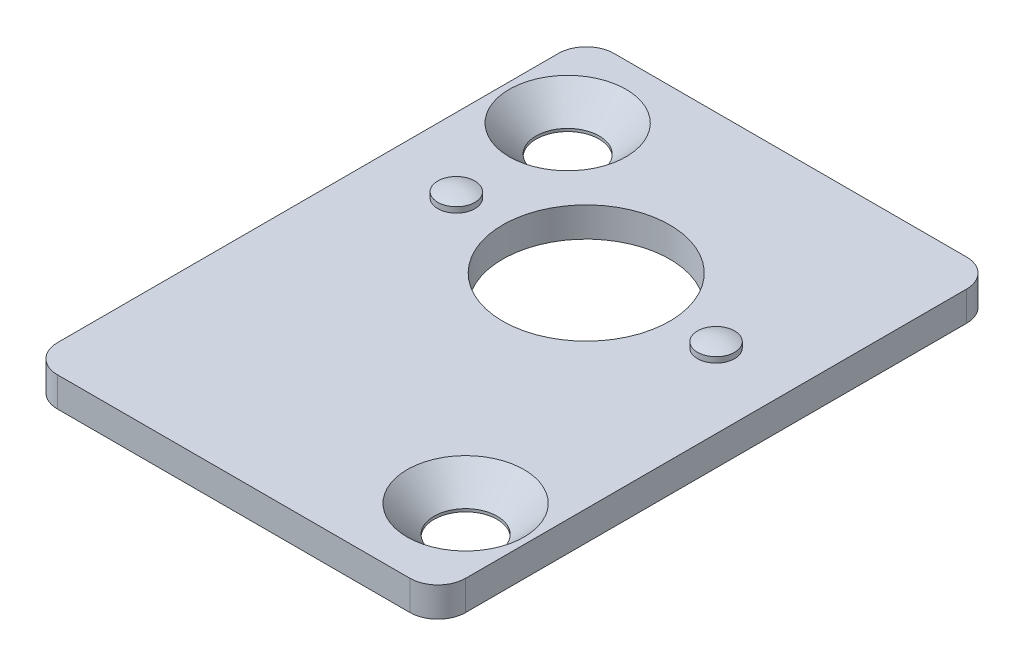
ISO-10303-21;
HEADER;
FILE_DESCRIPTION(('STEP AP214'),'2;1');
FILE_NAME('part.step','',(''),(''),'','','');
FILE_SCHEMA(('AUTOMOTIVE_DESIGN { 1 0 10303 214 1 1 1 1 }'));
ENDSEC;
DATA;
#1=APPLICATION_CONTEXT('core data for automotive mechanical design processes');
#2=APPLICATION_PROTOCOL_DEFINITION('international standard','automotive_design',2000,#1);
#3=PRODUCT_CONTEXT('',#1,'mechanical');
#4=PRODUCT('Part','Part','',(#3));
#5=PRODUCT_RELATED_PRODUCT_CATEGORY('part','',(#4));
#6=PRODUCT_DEFINITION_FORMATION('','',#4);
#7=PRODUCT_DEFINITION_CONTEXT('part definition',#1,'design');
#8=PRODUCT_DEFINITION('design','',#6,#7);
#9=PRODUCT_DEFINITION_SHAPE('','',#8);
#10=(LENGTH_UNIT() NAMED_UNIT(*) SI_UNIT(.MILLI.,.METRE.));
#11=(NAMED_UNIT(*) PLANE_ANGLE_UNIT() SI_UNIT($,.RADIAN.));
#12=(NAMED_UNIT(*) SI_UNIT($,.STERADIAN.) SOLID_ANGLE_UNIT());
#13=UNCERTAINTY_MEASURE_WITH_UNIT(LENGTH_MEASURE(1.E-05),#10,'distance_accuracy_value','');
#14=(GEOMETRIC_REPRESENTATION_CONTEXT(3) GLOBAL_UNCERTAINTY_ASSIGNED_CONTEXT((#13)) GLOBAL_UNIT_ASSIGNED_CONTEXT((#10,
#11,#12)) REPRESENTATION_CONTEXT('',''));
#15=CARTESIAN_POINT('',(0.,0.,0.));
#16=DIRECTION('',(0.,0.,1.));
#17=DIRECTION('',(1.,0.,0.));
#18=AXIS2_PLACEMENT_3D('',#15,#16,#17);
#19=CARTESIAN_POINT('',(11.,-1.6,-15.));
#20=DIRECTION('',(1.,0.,0.));
#21=DIRECTION('',(0.,0.,-1.));
#22=AXIS2_PLACEMENT_3D('',#19,#20,#21);
#23=PLANE('',#22);
#24=DIRECTION('',(0.,0.,-1.));
#25=VECTOR('',#24,1.);
#26=CARTESIAN_POINT('',(11.,-1.6,-15.));
#27=LINE('',#26,#25);
#28=CARTESIAN_POINT('',(11.,-1.6,13.5));
#29=VERTEX_POINT('',#28);
#30=CARTESIAN_POINT('',(11.,-1.6,-13.5));
#31=VERTEX_POINT('',#30);
#32=EDGE_CURVE('E154',#29,#31,#27,.T.);
#33=ORIENTED_EDGE('',*,*,#32,.T.);
#34=DIRECTION('',(0.,1.,0.));
#35=VECTOR('',#34,1.);
#36=CARTESIAN_POINT('',(11.,-1.6,-13.5));
#37=LINE('',#36,#35);
#38=CARTESIAN_POINT('',(11.,0.,-13.5));
#39=VERTEX_POINT('',#38);
#40=EDGE_CURVE('E150',#31,#39,#37,.T.);
#41=ORIENTED_EDGE('',*,*,#40,.T.);
#42=DIRECTION('',(0.,0.,-1.));
#43=VECTOR('',#42,1.);
#44=CARTESIAN_POINT('',(11.,0.,-15.));
#45=LINE('',#44,#43);
#46=CARTESIAN_POINT('',(11.,0.,13.5));
#47=VERTEX_POINT('',#46);
#48=EDGE_CURVE('E103',#47,#39,#45,.T.);
#49=ORIENTED_EDGE('',*,*,#48,.F.);
#50=DIRECTION('',(0.,1.,0.));
#51=VECTOR('',#50,1.);
#52=CARTESIAN_POINT('',(11.,-1.6,13.5));
#53=LINE('',#52,#51);
#54=EDGE_CURVE('E148',#47,#29,#53,.F.);
#55=ORIENTED_EDGE('',*,*,#54,.T.);
#56=EDGE_LOOP('',(#33,#41,#49,#55));
#57=FACE_BOUND('',#56,.T.);
#58=ADVANCED_FACE('F32',(#57),#23,.T.);
#59=CARTESIAN_POINT('',(-11.,-1.6,15.));
#60=DIRECTION('',(0.,0.,1.));
#61=DIRECTION('',(1.,0.,0.));
#62=AXIS2_PLACEMENT_3D('',#59,#60,#61);
#63=PLANE('',#62);
#64=DIRECTION('',(1.,0.,0.));
#65=VECTOR('',#64,1.);
#66=CARTESIAN_POINT('',(-11.,-1.6,15.));
#67=LINE('',#66,#65);
#68=CARTESIAN_POINT('',(-9.5,-1.6,15.));
#69=VERTEX_POINT('',#68);
#70=CARTESIAN_POINT('',(9.5,-1.6,15.));
#71=VERTEX_POINT('',#70);
#72=EDGE_CURVE('E129',#69,#71,#67,.T.);
#73=ORIENTED_EDGE('',*,*,#72,.T.);
#74=DIRECTION('',(0.,1.,0.));
#75=VECTOR('',#74,1.);
#76=CARTESIAN_POINT('',(9.5,-1.6,15.));
#77=LINE('',#76,#75);
#78=CARTESIAN_POINT('',(9.5,0.,15.));
#79=VERTEX_POINT('',#78);
#80=EDGE_CURVE('E11',#71,#79,#77,.T.);
#81=ORIENTED_EDGE('',*,*,#80,.T.);
#82=DIRECTION('',(1.,0.,0.));
#83=VECTOR('',#82,1.);
#84=CARTESIAN_POINT('',(-11.,0.,15.));
#85=LINE('',#84,#83);
#86=CARTESIAN_POINT('',(-9.5,0.,15.));
#87=VERTEX_POINT('',#86);
#88=EDGE_CURVE('E156',#87,#79,#85,.T.);
#89=ORIENTED_EDGE('',*,*,#88,.F.);
#90=DIRECTION('',(0.,1.,0.));
#91=VECTOR('',#90,1.);
#92=CARTESIAN_POINT('',(-9.5,-1.6,15.));
#93=LINE('',#92,#91);
#94=EDGE_CURVE('E40',#87,#69,#93,.F.);
#95=ORIENTED_EDGE('',*,*,#94,.T.);
#96=EDGE_LOOP('',(#73,#81,#89,#95));
#97=FACE_BOUND('',#96,.T.);
#98=ADVANCED_FACE('F227',(#97),#63,.T.);
#99=CARTESIAN_POINT('',(-11.,-1.6,-15.));
#100=DIRECTION('',(-1.,0.,0.));
#101=DIRECTION('',(0.,0.,1.));
#102=AXIS2_PLACEMENT_3D('',#99,#100,#101);
#103=PLANE('',#102);
#104=DIRECTION('',(0.,0.,1.));
#105=VECTOR('',#104,1.);
#106=CARTESIAN_POINT('',(-11.,0.,-15.));
#107=LINE('',#106,#105);
#108=CARTESIAN_POINT('',(-11.,0.,-13.5));
#109=VERTEX_POINT('',#108);
#110=CARTESIAN_POINT('',(-11.,0.,13.5));
#111=VERTEX_POINT('',#110);
#112=EDGE_CURVE('E119',#109,#111,#107,.T.);
#113=ORIENTED_EDGE('',*,*,#112,.F.);
#114=DIRECTION('',(0.,1.,0.));
#115=VECTOR('',#114,1.);
#116=CARTESIAN_POINT('',(-11.,-1.6,-13.5));
#117=LINE('',#116,#115);
#118=CARTESIAN_POINT('',(-11.,-1.6,-13.5));
#119=VERTEX_POINT('',#118);
#120=EDGE_CURVE('E140',#109,#119,#117,.F.);
#121=ORIENTED_EDGE('',*,*,#120,.T.);
#122=DIRECTION('',(0.,0.,1.));
#123=VECTOR('',#122,1.);
#124=CARTESIAN_POINT('',(-11.,-1.6,-15.));
#125=LINE('',#124,#123);
#126=CARTESIAN_POINT('',(-11.,-1.6,13.5));
#127=VERTEX_POINT('',#126);
#128=EDGE_CURVE('E158',#119,#127,#125,.T.);
#129=ORIENTED_EDGE('',*,*,#128,.T.);
#130=DIRECTION('',(0.,1.,0.));
#131=VECTOR('',#130,1.);
#132=CARTESIAN_POINT('',(-11.,-1.6,13.5));
#133=LINE('',#132,#131);
#134=EDGE_CURVE('E137',#127,#111,#133,.T.);
#135=ORIENTED_EDGE('',*,*,#134,.T.);
#136=EDGE_LOOP('',(#113,#121,#129,#135));
#137=FACE_BOUND('',#136,.T.);
#138=ADVANCED_FACE('F232',(#137),#103,.T.);
#139=CARTESIAN_POINT('',(-11.,-1.6,-15.));
#140=DIRECTION('',(0.,0.,-1.));
#141=DIRECTION('',(-1.,0.,0.));
#142=AXIS2_PLACEMENT_3D('',#139,#140,#141);
#143=PLANE('',#142);
#144=DIRECTION('',(-1.,0.,0.));
#145=VECTOR('',#144,1.);
#146=CARTESIAN_POINT('',(-11.,-1.6,-15.));
#147=LINE('',#146,#145);
#148=CARTESIAN_POINT('',(9.49999999999999,-1.6,-15.));
#149=VERTEX_POINT('',#148);
#150=CARTESIAN_POINT('',(-9.5,-1.6,-15.));
#151=VERTEX_POINT('',#150);
#152=EDGE_CURVE('E155',#149,#151,#147,.T.);
#153=ORIENTED_EDGE('',*,*,#152,.T.);
#154=DIRECTION('',(0.,1.,0.));
#155=VECTOR('',#154,1.);
#156=CARTESIAN_POINT('',(-9.5,-1.6,-15.));
#157=LINE('',#156,#155);
#158=CARTESIAN_POINT('',(-9.5,0.,-15.));
#159=VERTEX_POINT('',#158);
#160=EDGE_CURVE('E118',#151,#159,#157,.T.);
#161=ORIENTED_EDGE('',*,*,#160,.T.);
#162=DIRECTION('',(-1.,0.,0.));
#163=VECTOR('',#162,1.);
#164=CARTESIAN_POINT('',(-11.,0.,-15.));
#165=LINE('',#164,#163);
#166=CARTESIAN_POINT('',(9.49999999999999,0.,-15.));
#167=VERTEX_POINT('',#166);
#168=EDGE_CURVE('E101',#167,#159,#165,.T.);
#169=ORIENTED_EDGE('',*,*,#168,.F.);
#170=DIRECTION('',(0.,1.,0.));
#171=VECTOR('',#170,1.);
#172=CARTESIAN_POINT('',(9.49999999999999,-1.6,-15.));
#173=LINE('',#172,#171);
#174=EDGE_CURVE('E115',#167,#149,#173,.F.);
#175=ORIENTED_EDGE('',*,*,#174,.T.);
#176=EDGE_LOOP('',(#153,#161,#169,#175));
#177=FACE_BOUND('',#176,.T.);
#178=ADVANCED_FACE('F114',(#177),#143,.T.);
#179=CARTESIAN_POINT('',(0.,-1.6,0.));
#180=DIRECTION('',(0.,1.,0.));
#181=DIRECTION('',(0.,0.,1.));
#182=AXIS2_PLACEMENT_3D('',#179,#180,#181);
#183=PLANE('',#182);
#184=CARTESIAN_POINT('',(-7.,-1.6,-4.00000000000001));
#185=DIRECTION('',(0.,-1.,0.));
#186=DIRECTION('',(0.,0.,-1.));
#187=AXIS2_PLACEMENT_3D('',#184,#185,#186);
#188=CIRCLE('',#187,1.);
#189=CARTESIAN_POINT('',(-7.,-1.6,-5.00000000000001));
#190=VERTEX_POINT('',#189);
#191=EDGE_CURVE('E453',#190,#190,#188,.T.);
#192=ORIENTED_EDGE('',*,*,#191,.F.);
#193=EDGE_LOOP('',(#192));
#194=FACE_BOUND('',#193,.T.);
#195=CARTESIAN_POINT('',(7.,-1.6,-4.00000000000001));
#196=DIRECTION('',(0.,-1.,0.));
#197=DIRECTION('',(0.,0.,-1.));
#198=AXIS2_PLACEMENT_3D('',#195,#196,#197);
#199=CIRCLE('',#198,1.);
#200=CARTESIAN_POINT('',(7.,-1.6,-5.00000000000001));
#201=VERTEX_POINT('',#200);
#202=EDGE_CURVE('E197',#201,#201,#199,.T.);
#203=ORIENTED_EDGE('',*,*,#202,.F.);
#204=EDGE_LOOP('',(#203));
#205=FACE_BOUND('',#204,.T.);
#206=CARTESIAN_POINT('',(0.,-1.6,-4.00000000000001));
#207=DIRECTION('',(0.,1.,0.));
#208=DIRECTION('',(0.,0.,1.));
#209=AXIS2_PLACEMENT_3D('',#206,#207,#208);
#210=CIRCLE('',#209,4.5);
#211=CARTESIAN_POINT('',(0.,-1.6,0.499999999999991));
#212=VERTEX_POINT('',#211);
#213=EDGE_CURVE('E187',#212,#212,#210,.T.);
#214=ORIENTED_EDGE('',*,*,#213,.T.);
#215=EDGE_LOOP('',(#214));
#216=FACE_BOUND('',#215,.T.);
#217=CARTESIAN_POINT('',(-7.5,-1.6,-10.5));
#218=DIRECTION('',(0.,1.,0.));
#219=DIRECTION('',(0.,0.,1.));
#220=AXIS2_PLACEMENT_3D('',#217,#218,#219);
#221=CIRCLE('',#220,1.7);
#222=CARTESIAN_POINT('',(-7.5,-1.6,-8.80000000000001));
#223=VERTEX_POINT('',#222);
#224=EDGE_CURVE('E175',#223,#223,#221,.T.);
#225=ORIENTED_EDGE('',*,*,#224,.T.);
#226=EDGE_LOOP('',(#225));
#227=FACE_BOUND('',#226,.T.);
#228=CARTESIAN_POINT('',(7.5,-1.6,9.99999999999999));
#229=DIRECTION('',(0.,1.,0.));
#230=DIRECTION('',(0.,0.,1.));
#231=AXIS2_PLACEMENT_3D('',#228,#229,#230);
#232=CIRCLE('',#231,1.7);
#233=CARTESIAN_POINT('',(7.5,-1.6,11.7));
#234=VERTEX_POINT('',#233);
#235=EDGE_CURVE('E169',#234,#234,#232,.T.);
#236=ORIENTED_EDGE('',*,*,#235,.T.);
#237=EDGE_LOOP('',(#236));
#238=FACE_BOUND('',#237,.T.);
#239=ORIENTED_EDGE('',*,*,#128,.F.);
#240=CARTESIAN_POINT('',(-9.5,-1.6,-13.5));
#241=DIRECTION('',(0.,1.,0.));
#242=DIRECTION('',(0.,0.,1.));
#243=AXIS2_PLACEMENT_3D('',#240,#241,#242);
#244=CIRCLE('',#243,1.5);
#245=EDGE_CURVE('E146',#119,#151,#244,.F.);
#246=ORIENTED_EDGE('',*,*,#245,.T.);
#247=ORIENTED_EDGE('',*,*,#152,.F.);
#248=CARTESIAN_POINT('',(9.5,-1.6,-13.5));
#249=DIRECTION('',(0.,1.,0.));
#250=DIRECTION('',(0.,0.,1.));
#251=AXIS2_PLACEMENT_3D('',#248,#249,#250);
#252=CIRCLE('',#251,1.5);
#253=EDGE_CURVE('E123',#149,#31,#252,.F.);
#254=ORIENTED_EDGE('',*,*,#253,.T.);
#255=ORIENTED_EDGE('',*,*,#32,.F.);
#256=CARTESIAN_POINT('',(9.5,-1.6,13.5));
#257=DIRECTION('',(0.,1.,0.));
#258=DIRECTION('',(0.,0.,1.));
#259=AXIS2_PLACEMENT_3D('',#256,#257,#258);
#260=CIRCLE('',#259,1.5);
#261=EDGE_CURVE('E47',#29,#71,#260,.F.);
#262=ORIENTED_EDGE('',*,*,#261,.T.);
#263=ORIENTED_EDGE('',*,*,#72,.F.);
#264=CARTESIAN_POINT('',(-9.5,-1.6,13.5));
#265=DIRECTION('',(0.,1.,0.));
#266=DIRECTION('',(0.,0.,1.));
#267=AXIS2_PLACEMENT_3D('',#264,#265,#266);
#268=CIRCLE('',#267,1.5);
#269=EDGE_CURVE('E142',#69,#127,#268,.F.);
#270=ORIENTED_EDGE('',*,*,#269,.T.);
#271=EDGE_LOOP('',(#239,#246,#247,#254,#255,#262,#263,#270));
#272=FACE_BOUND('',#271,.T.);
#273=ADVANCED_FACE('F268',(#194,#205,#216,#227,#238,#272),#183,.F.);
#274=CARTESIAN_POINT('',(0.,0.,0.));
#275=DIRECTION('',(0.,1.,0.));
#276=DIRECTION('',(0.,0.,1.));
#277=AXIS2_PLACEMENT_3D('',#274,#275,#276);
#278=PLANE('',#277);
#279=CARTESIAN_POINT('',(7.,0.,-4.00000000000001));
#280=DIRECTION('',(0.,1.,0.));
#281=DIRECTION('',(0.,0.,1.));
#282=AXIS2_PLACEMENT_3D('',#279,#280,#281);
#283=CIRCLE('',#282,1.);
#284=CARTESIAN_POINT('',(7.,0.,-3.00000000000001));
#285=VERTEX_POINT('',#284);
#286=EDGE_CURVE('E124',#285,#285,#283,.T.);
#287=ORIENTED_EDGE('',*,*,#286,.F.);
#288=EDGE_LOOP('',(#287));
#289=FACE_BOUND('',#288,.T.);
#290=CARTESIAN_POINT('',(-7.,0.,-4.00000000000001));
#291=DIRECTION('',(0.,1.,0.));
#292=DIRECTION('',(0.,0.,1.));
#293=AXIS2_PLACEMENT_3D('',#290,#291,#292);
#294=CIRCLE('',#293,1.);
#295=CARTESIAN_POINT('',(-7.,0.,-3.00000000000001));
#296=VERTEX_POINT('',#295);
#297=EDGE_CURVE('E183',#296,#296,#294,.T.);
#298=ORIENTED_EDGE('',*,*,#297,.F.);
#299=EDGE_LOOP('',(#298));
#300=FACE_BOUND('',#299,.T.);
#301=CARTESIAN_POINT('',(0.,0.,-4.00000000000001));
#302=DIRECTION('',(0.,1.,0.));
#303=DIRECTION('',(0.,0.,1.));
#304=AXIS2_PLACEMENT_3D('',#301,#302,#303);
#305=CIRCLE('',#304,4.5);
#306=CARTESIAN_POINT('',(0.,0.,0.499999999999991));
#307=VERTEX_POINT('',#306);
#308=EDGE_CURVE('E182',#307,#307,#305,.T.);
#309=ORIENTED_EDGE('',*,*,#308,.F.);
#310=EDGE_LOOP('',(#309));
#311=FACE_BOUND('',#310,.T.);
#312=CARTESIAN_POINT('',(-7.5,0.,-10.5));
#313=DIRECTION('',(0.,1.,0.));
#314=DIRECTION('',(0.,0.,1.));
#315=AXIS2_PLACEMENT_3D('',#312,#313,#314);
#316=CIRCLE('',#315,3.15);
#317=CARTESIAN_POINT('',(-7.5,0.,-7.35000000000001));
#318=VERTEX_POINT('',#317);
#319=EDGE_CURVE('E200',#318,#318,#316,.T.);
#320=ORIENTED_EDGE('',*,*,#319,.F.);
#321=EDGE_LOOP('',(#320));
#322=FACE_BOUND('',#321,.T.);
#323=CARTESIAN_POINT('',(7.5,0.,9.99999999999999));
#324=DIRECTION('',(0.,1.,0.));
#325=DIRECTION('',(0.,0.,1.));
#326=AXIS2_PLACEMENT_3D('',#323,#324,#325);
#327=CIRCLE('',#326,3.15);
#328=CARTESIAN_POINT('',(7.5,0.,13.15));
#329=VERTEX_POINT('',#328);
#330=EDGE_CURVE('E178',#329,#329,#327,.T.);
#331=ORIENTED_EDGE('',*,*,#330,.F.);
#332=EDGE_LOOP('',(#331));
#333=FACE_BOUND('',#332,.T.);
#334=ORIENTED_EDGE('',*,*,#168,.T.);
#335=CARTESIAN_POINT('',(-9.5,0.,-13.5));
#336=DIRECTION('',(0.,1.,0.));
#337=DIRECTION('',(0.,0.,1.));
#338=AXIS2_PLACEMENT_3D('',#335,#336,#337);
#339=CIRCLE('',#338,1.5);
#340=EDGE_CURVE('E108',#159,#109,#339,.T.);
#341=ORIENTED_EDGE('',*,*,#340,.T.);
#342=ORIENTED_EDGE('',*,*,#112,.T.);
#343=CARTESIAN_POINT('',(-9.5,0.,13.5));
#344=DIRECTION('',(0.,1.,0.));
#345=DIRECTION('',(0.,0.,1.));
#346=AXIS2_PLACEMENT_3D('',#343,#344,#345);
#347=CIRCLE('',#346,1.5);
#348=EDGE_CURVE('E126',#111,#87,#347,.T.);
#349=ORIENTED_EDGE('',*,*,#348,.T.);
#350=ORIENTED_EDGE('',*,*,#88,.T.);
#351=CARTESIAN_POINT('',(9.5,0.,13.5));
#352=DIRECTION('',(0.,1.,0.));
#353=DIRECTION('',(0.,0.,1.));
#354=AXIS2_PLACEMENT_3D('',#351,#352,#353);
#355=CIRCLE('',#354,1.5);
#356=EDGE_CURVE('E109',#79,#47,#355,.T.);
#357=ORIENTED_EDGE('',*,*,#356,.T.);
#358=ORIENTED_EDGE('',*,*,#48,.T.);
#359=CARTESIAN_POINT('',(9.5,0.,-13.5));
#360=DIRECTION('',(0.,1.,0.));
#361=DIRECTION('',(0.,0.,1.));
#362=AXIS2_PLACEMENT_3D('',#359,#360,#361);
#363=CIRCLE('',#362,1.5);
#364=EDGE_CURVE('E98',#39,#167,#363,.T.);
#365=ORIENTED_EDGE('',*,*,#364,.T.);
#366=EDGE_LOOP('',(#334,#341,#342,#349,#350,#357,#358,#365));
#367=FACE_BOUND('',#366,.T.);
#368=ADVANCED_FACE('F100',(#289,#300,#311,#322,#333,#367),#278,.T.);
#369=CARTESIAN_POINT('',(7.5,0.,9.99999999999999));
#370=DIRECTION('',(0.,1.,0.));
#371=DIRECTION('',(0.,0.,1.));
#372=AXIS2_PLACEMENT_3D('',#369,#370,#371);
#373=CYLINDRICAL_SURFACE('',#372,1.7);
#374=CARTESIAN_POINT('',(7.5,-1.45,9.99999999999999));
#375=DIRECTION('',(0.,1.,0.));
#376=DIRECTION('',(0.,0.,1.));
#377=AXIS2_PLACEMENT_3D('',#374,#375,#376);
#378=CIRCLE('',#377,1.7);
#379=CARTESIAN_POINT('',(7.5,-1.45,11.7));
#380=VERTEX_POINT('',#379);
#381=EDGE_CURVE('E163',#380,#380,#378,.T.);
#382=ORIENTED_EDGE('',*,*,#381,.T.);
#383=EDGE_LOOP('',(#382));
#384=FACE_BOUND('',#383,.T.);
#385=ORIENTED_EDGE('',*,*,#235,.F.);
#386=EDGE_LOOP('',(#385));
#387=FACE_BOUND('',#386,.T.);
#388=ADVANCED_FACE('F211',(#384,#387),#373,.F.);
#389=CARTESIAN_POINT('',(7.5,0.,9.99999999999999));
#390=DIRECTION('',(0.,1.,0.));
#391=DIRECTION('',(0.,0.,1.));
#392=AXIS2_PLACEMENT_3D('',#389,#390,#391);
#393=CONICAL_SURFACE('',#392,3.15,0.785398163397448);
#394=ORIENTED_EDGE('',*,*,#381,.F.);
#395=EDGE_LOOP('',(#394));
#396=FACE_BOUND('',#395,.T.);
#397=ORIENTED_EDGE('',*,*,#330,.T.);
#398=EDGE_LOOP('',(#397));
#399=FACE_BOUND('',#398,.T.);
#400=ADVANCED_FACE('F214',(#396,#399),#393,.F.);
#401=CARTESIAN_POINT('',(-7.5,0.,-10.5));
#402=DIRECTION('',(0.,1.,0.));
#403=DIRECTION('',(0.,0.,1.));
#404=AXIS2_PLACEMENT_3D('',#401,#402,#403);
#405=CYLINDRICAL_SURFACE('',#404,1.7);
#406=CARTESIAN_POINT('',(-7.5,-1.45,-10.5));
#407=DIRECTION('',(0.,1.,0.));
#408=DIRECTION('',(0.,0.,1.));
#409=AXIS2_PLACEMENT_3D('',#406,#407,#408);
#410=CIRCLE('',#409,1.7);
#411=CARTESIAN_POINT('',(-7.5,-1.45,-8.80000000000001));
#412=VERTEX_POINT('',#411);
#413=EDGE_CURVE('E179',#412,#412,#410,.T.);
#414=ORIENTED_EDGE('',*,*,#413,.T.);
#415=EDGE_LOOP('',(#414));
#416=FACE_BOUND('',#415,.T.);
#417=ORIENTED_EDGE('',*,*,#224,.F.);
#418=EDGE_LOOP('',(#417));
#419=FACE_BOUND('',#418,.T.);
#420=ADVANCED_FACE('F216',(#416,#419),#405,.F.);
#421=CARTESIAN_POINT('',(-7.5,0.,-10.5));
#422=DIRECTION('',(0.,1.,0.));
#423=DIRECTION('',(0.,0.,1.));
#424=AXIS2_PLACEMENT_3D('',#421,#422,#423);
#425=CONICAL_SURFACE('',#424,3.15,0.785398163397448);
#426=ORIENTED_EDGE('',*,*,#413,.F.);
#427=EDGE_LOOP('',(#426));
#428=FACE_BOUND('',#427,.T.);
#429=ORIENTED_EDGE('',*,*,#319,.T.);
#430=EDGE_LOOP('',(#429));
#431=FACE_BOUND('',#430,.T.);
#432=ADVANCED_FACE('F222',(#428,#431),#425,.F.);
#433=CARTESIAN_POINT('',(0.,-1.6,-4.00000000000001));
#434=DIRECTION('',(0.,1.,0.));
#435=DIRECTION('',(0.,0.,1.));
#436=AXIS2_PLACEMENT_3D('',#433,#434,#435);
#437=CYLINDRICAL_SURFACE('',#436,4.5);
#438=ORIENTED_EDGE('',*,*,#213,.F.);
#439=EDGE_LOOP('',(#438));
#440=FACE_BOUND('',#439,.T.);
#441=ORIENTED_EDGE('',*,*,#308,.T.);
#442=EDGE_LOOP('',(#441));
#443=FACE_BOUND('',#442,.T.);
#444=ADVANCED_FACE('F375',(#440,#443),#437,.F.);
#445=CARTESIAN_POINT('',(-7.,0.3,-4.00000000000001));
#446=DIRECTION('',(0.,-1.,0.));
#447=DIRECTION('',(0.,0.,-1.));
#448=AXIS2_PLACEMENT_3D('',#445,#446,#447);
#449=CYLINDRICAL_SURFACE('',#448,1.);
#450=CARTESIAN_POINT('',(-7.,0.3,-4.00000000000001));
#451=DIRECTION('',(0.,1.,0.));
#452=DIRECTION('',(0.,0.,1.));
#453=AXIS2_PLACEMENT_3D('',#450,#451,#452);
#454=CIRCLE('',#453,1.);
#455=CARTESIAN_POINT('',(-7.,0.3,-3.00000000000001));
#456=VERTEX_POINT('',#455);
#457=EDGE_CURVE('E180',#456,#456,#454,.T.);
#458=ORIENTED_EDGE('',*,*,#457,.F.);
#459=EDGE_LOOP('',(#458));
#460=FACE_BOUND('',#459,.T.);
#461=ORIENTED_EDGE('',*,*,#297,.T.);
#462=EDGE_LOOP('',(#461));
#463=FACE_BOUND('',#462,.T.);
#464=ADVANCED_FACE('F241',(#460,#463),#449,.T.);
#465=CARTESIAN_POINT('',(-7.,-2.1,-4.00000000000001));
#466=DIRECTION('',(0.,0.,1.));
#467=DIRECTION('',(1.,0.,0.));
#468=AXIS2_PLACEMENT_3D('',#465,#466,#467);
#469=SPHERICAL_SURFACE('',#468,2.6);
#470=CARTESIAN_POINT('',(-7.,-2.1,-4.00000000000001));
#471=DIRECTION('',(0.,1.,0.));
#472=DIRECTION('',(0.,0.,1.));
#473=AXIS2_PLACEMENT_3D('',#470,#471,#472);
#474=SPHERICAL_SURFACE('',#473,2.6);
#475=ORIENTED_EDGE('',*,*,#457,.T.);
#476=EDGE_LOOP('',(#475));
#477=FACE_BOUND('',#476,.T.);
#478=ADVANCED_FACE('F237',(#477),#474,.T.);
#479=CARTESIAN_POINT('',(7.,0.3,-4.00000000000001));
#480=DIRECTION('',(0.,-1.,0.));
#481=DIRECTION('',(0.,0.,-1.));
#482=AXIS2_PLACEMENT_3D('',#479,#480,#481);
#483=CYLINDRICAL_SURFACE('',#482,1.);
#484=CARTESIAN_POINT('',(7.,0.3,-4.00000000000001));
#485=DIRECTION('',(0.,-1.,0.));
#486=DIRECTION('',(0.,0.,1.));
#487=AXIS2_PLACEMENT_3D('',#484,#485,#486);
#488=CIRCLE('',#487,1.);
#489=CARTESIAN_POINT('',(7.,0.3,-3.00000000000001));
#490=VERTEX_POINT('',#489);
#491=EDGE_CURVE('E132',#490,#490,#488,.T.);
#492=ORIENTED_EDGE('',*,*,#491,.T.);
#493=EDGE_LOOP('',(#492));
#494=FACE_BOUND('',#493,.T.);
#495=ORIENTED_EDGE('',*,*,#286,.T.);
#496=EDGE_LOOP('',(#495));
#497=FACE_BOUND('',#496,.T.);
#498=ADVANCED_FACE('F240',(#494,#497),#483,.T.);
#499=CARTESIAN_POINT('',(7.,-2.1,-4.00000000000001));
#500=DIRECTION('',(0.,0.,1.));
#501=DIRECTION('',(1.,0.,0.));
#502=AXIS2_PLACEMENT_3D('',#499,#500,#501);
#503=SPHERICAL_SURFACE('',#502,2.6);
#504=CARTESIAN_POINT('',(7.,-2.1,-4.00000000000001));
#505=DIRECTION('',(0.,-1.,0.));
#506=DIRECTION('',(0.,0.,1.));
#507=AXIS2_PLACEMENT_3D('',#504,#505,#506);
#508=SPHERICAL_SURFACE('',#507,2.6);
#509=ORIENTED_EDGE('',*,*,#491,.F.);
#510=EDGE_LOOP('',(#509));
#511=FACE_BOUND('',#510,.T.);
#512=ADVANCED_FACE('F242',(#511),#508,.T.);
#513=CARTESIAN_POINT('',(7.,-1.3,-4.00000000000001));
#514=DIRECTION('',(0.,-1.,0.));
#515=DIRECTION('',(0.,0.,-1.));
#516=AXIS2_PLACEMENT_3D('',#513,#514,#515);
#517=CYLINDRICAL_SURFACE('',#516,1.);
#518=CARTESIAN_POINT('',(7.,-1.3,-4.00000000000001));
#519=DIRECTION('',(0.,-1.,0.));
#520=DIRECTION('',(0.,0.,-1.));
#521=AXIS2_PLACEMENT_3D('',#518,#519,#520);
#522=CIRCLE('',#521,1.);
#523=CARTESIAN_POINT('',(7.,-1.3,-5.00000000000001));
#524=VERTEX_POINT('',#523);
#525=EDGE_CURVE('E450',#524,#524,#522,.T.);
#526=ORIENTED_EDGE('',*,*,#525,.F.);
#527=EDGE_LOOP('',(#526));
#528=FACE_BOUND('',#527,.T.);
#529=ORIENTED_EDGE('',*,*,#202,.T.);
#530=EDGE_LOOP('',(#529));
#531=FACE_BOUND('',#530,.T.);
#532=ADVANCED_FACE('F245',(#528,#531),#517,.F.);
#533=CARTESIAN_POINT('',(7.,-1.3,-4.00000000000001));
#534=DIRECTION('',(0.,-1.,0.));
#535=DIRECTION('',(0.,0.,-1.));
#536=AXIS2_PLACEMENT_3D('',#533,#534,#535);
#537=PLANE('',#536);
#538=ORIENTED_EDGE('',*,*,#525,.T.);
#539=EDGE_LOOP('',(#538));
#540=FACE_BOUND('',#539,.T.);
#541=ADVANCED_FACE('F338',(#540),#537,.T.);
#542=CARTESIAN_POINT('',(-7.,-1.3,-4.00000000000001));
#543=DIRECTION('',(0.,-1.,0.));
#544=DIRECTION('',(0.,0.,-1.));
#545=AXIS2_PLACEMENT_3D('',#542,#543,#544);
#546=CYLINDRICAL_SURFACE('',#545,1.);
#547=CARTESIAN_POINT('',(-7.,-1.3,-4.00000000000001));
#548=DIRECTION('',(0.,-1.,0.));
#549=DIRECTION('',(0.,0.,-1.));
#550=AXIS2_PLACEMENT_3D('',#547,#548,#549);
#551=CIRCLE('',#550,1.);
#552=CARTESIAN_POINT('',(-7.,-1.3,-5.00000000000001));
#553=VERTEX_POINT('',#552);
#554=EDGE_CURVE('E194',#553,#553,#551,.T.);
#555=ORIENTED_EDGE('',*,*,#554,.F.);
#556=EDGE_LOOP('',(#555));
#557=FACE_BOUND('',#556,.T.);
#558=ORIENTED_EDGE('',*,*,#191,.T.);
#559=EDGE_LOOP('',(#558));
#560=FACE_BOUND('',#559,.T.);
#561=ADVANCED_FACE('F331',(#557,#560),#546,.F.);
#562=CARTESIAN_POINT('',(-7.,-1.3,-4.00000000000001));
#563=DIRECTION('',(0.,-1.,0.));
#564=DIRECTION('',(0.,0.,-1.));
#565=AXIS2_PLACEMENT_3D('',#562,#563,#564);
#566=PLANE('',#565);
#567=ORIENTED_EDGE('',*,*,#554,.T.);
#568=EDGE_LOOP('',(#567));
#569=FACE_BOUND('',#568,.T.);
#570=ADVANCED_FACE('F250',(#569),#566,.T.);
#571=CARTESIAN_POINT('',(-9.5,-1.6,-13.5));
#572=DIRECTION('',(0.,1.,0.));
#573=DIRECTION('',(0.,0.,1.));
#574=AXIS2_PLACEMENT_3D('',#571,#572,#573);
#575=CYLINDRICAL_SURFACE('',#574,1.5);
#576=ORIENTED_EDGE('',*,*,#245,.F.);
#577=ORIENTED_EDGE('',*,*,#120,.F.);
#578=ORIENTED_EDGE('',*,*,#340,.F.);
#579=ORIENTED_EDGE('',*,*,#160,.F.);
#580=EDGE_LOOP('',(#576,#577,#578,#579));
#581=FACE_BOUND('',#580,.T.);
#582=ADVANCED_FACE('F247',(#581),#575,.T.);
#583=CARTESIAN_POINT('',(9.5,-1.6,-13.5));
#584=DIRECTION('',(0.,1.,0.));
#585=DIRECTION('',(0.,0.,1.));
#586=AXIS2_PLACEMENT_3D('',#583,#584,#585);
#587=CYLINDRICAL_SURFACE('',#586,1.5);
#588=ORIENTED_EDGE('',*,*,#253,.F.);
#589=ORIENTED_EDGE('',*,*,#174,.F.);
#590=ORIENTED_EDGE('',*,*,#364,.F.);
#591=ORIENTED_EDGE('',*,*,#40,.F.);
#592=EDGE_LOOP('',(#588,#589,#590,#591));
#593=FACE_BOUND('',#592,.T.);
#594=ADVANCED_FACE('F122',(#593),#587,.T.);
#595=CARTESIAN_POINT('',(9.5,-1.6,13.5));
#596=DIRECTION('',(0.,1.,0.));
#597=DIRECTION('',(0.,0.,1.));
#598=AXIS2_PLACEMENT_3D('',#595,#596,#597);
#599=CYLINDRICAL_SURFACE('',#598,1.5);
#600=ORIENTED_EDGE('',*,*,#261,.F.);
#601=ORIENTED_EDGE('',*,*,#54,.F.);
#602=ORIENTED_EDGE('',*,*,#356,.F.);
#603=ORIENTED_EDGE('',*,*,#80,.F.);
#604=EDGE_LOOP('',(#600,#601,#602,#603));
#605=FACE_BOUND('',#604,.T.);
#606=ADVANCED_FACE('F253',(#605),#599,.T.);
#607=CARTESIAN_POINT('',(-9.5,-1.6,13.5));
#608=DIRECTION('',(0.,1.,0.));
#609=DIRECTION('',(0.,0.,1.));
#610=AXIS2_PLACEMENT_3D('',#607,#608,#609);
#611=CYLINDRICAL_SURFACE('',#610,1.5);
#612=ORIENTED_EDGE('',*,*,#269,.F.);
#613=ORIENTED_EDGE('',*,*,#94,.F.);
#614=ORIENTED_EDGE('',*,*,#348,.F.);
#615=ORIENTED_EDGE('',*,*,#134,.F.);
#616=EDGE_LOOP('',(#612,#613,#614,#615));
#617=FACE_BOUND('',#616,.T.);
#618=ADVANCED_FACE('F34',(#617),#611,.T.);
#619=CLOSED_SHELL('',(#58,#98,#138,#178,#273,#368,#388,#400,#420,#432,#444,#464,#478,#498,#512,
#532,#541,#561,#570,#582,#594,#606,#618));
#620=MANIFOLD_SOLID_BREP('B2',#619);
#621=ADVANCED_BREP_SHAPE_REPRESENTATION('',(#18,#620),#14);
#622=SHAPE_DEFINITION_REPRESENTATION(#9,#621);
ENDSEC;
END-ISO-10303-21;
